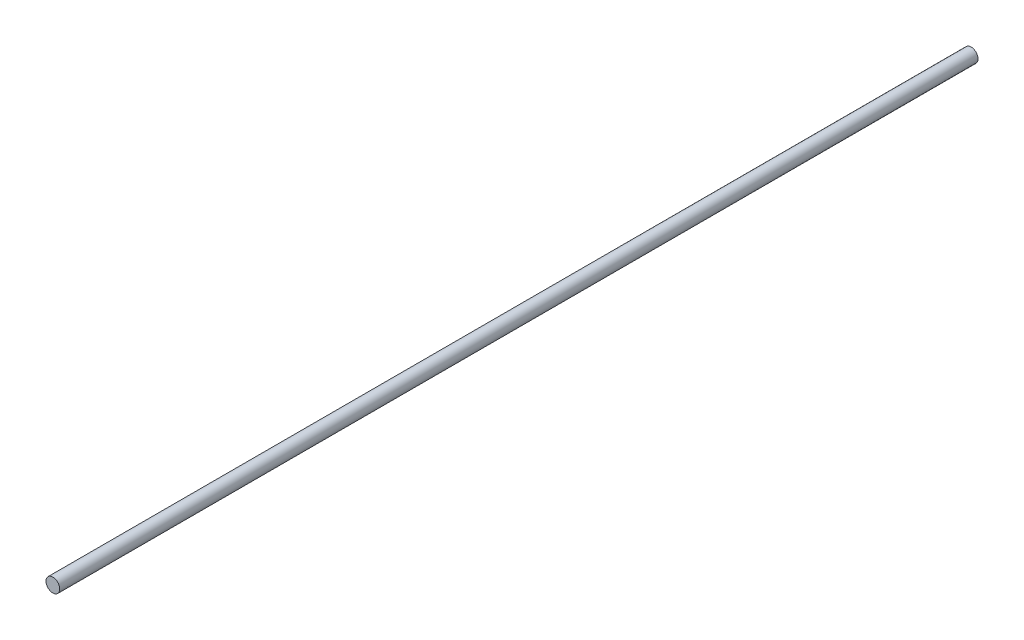
ISO-10303-21;
HEADER;
FILE_DESCRIPTION(('STEP AP214'),'2;1');
FILE_NAME('part.step','',(''),(''),'','','');
FILE_SCHEMA(('AUTOMOTIVE_DESIGN { 1 0 10303 214 1 1 1 1 }'));
ENDSEC;
DATA;
#1=APPLICATION_CONTEXT('core data for automotive mechanical design processes');
#2=APPLICATION_PROTOCOL_DEFINITION('international standard','automotive_design',2000,#1);
#3=PRODUCT_CONTEXT('',#1,'mechanical');
#4=PRODUCT('Part','Part','',(#3));
#5=PRODUCT_RELATED_PRODUCT_CATEGORY('part','',(#4));
#6=PRODUCT_DEFINITION_FORMATION('','',#4);
#7=PRODUCT_DEFINITION_CONTEXT('part definition',#1,'design');
#8=PRODUCT_DEFINITION('design','',#6,#7);
#9=PRODUCT_DEFINITION_SHAPE('','',#8);
#10=(LENGTH_UNIT() NAMED_UNIT(*) SI_UNIT(.MILLI.,.METRE.));
#11=(NAMED_UNIT(*) PLANE_ANGLE_UNIT() SI_UNIT($,.RADIAN.));
#12=(NAMED_UNIT(*) SI_UNIT($,.STERADIAN.) SOLID_ANGLE_UNIT());
#13=UNCERTAINTY_MEASURE_WITH_UNIT(LENGTH_MEASURE(1.E-05),#10,'distance_accuracy_value','');
#14=(GEOMETRIC_REPRESENTATION_CONTEXT(3) GLOBAL_UNCERTAINTY_ASSIGNED_CONTEXT((#13)) GLOBAL_UNIT_ASSIGNED_CONTEXT((#10,
#11,#12)) REPRESENTATION_CONTEXT('',''));
#15=CARTESIAN_POINT('',(0.,0.,0.));
#16=DIRECTION('',(0.,0.,1.));
#17=DIRECTION('',(1.,0.,0.));
#18=AXIS2_PLACEMENT_3D('',#15,#16,#17);
#19=CARTESIAN_POINT('',(0.,0.,400.));
#20=DIRECTION('',(0.,0.,-1.));
#21=DIRECTION('',(-1.,0.,0.));
#22=AXIS2_PLACEMENT_3D('',#19,#20,#21);
#23=CYLINDRICAL_SURFACE('',#22,3.);
#24=CARTESIAN_POINT('',(0.,0.,400.));
#25=DIRECTION('',(0.,0.,1.));
#26=DIRECTION('',(1.,0.,0.));
#27=AXIS2_PLACEMENT_3D('',#24,#25,#26);
#28=CIRCLE('',#27,3.);
#29=CARTESIAN_POINT('',(3.,0.,400.));
#30=VERTEX_POINT('',#29);
#31=EDGE_CURVE('E10',#30,#30,#28,.T.);
#32=ORIENTED_EDGE('',*,*,#31,.F.);
#33=EDGE_LOOP('',(#32));
#34=FACE_BOUND('',#33,.T.);
#35=CARTESIAN_POINT('',(0.,0.,0.));
#36=DIRECTION('',(0.,0.,1.));
#37=DIRECTION('',(1.,0.,0.));
#38=AXIS2_PLACEMENT_3D('',#35,#36,#37);
#39=CIRCLE('',#38,3.);
#40=CARTESIAN_POINT('',(3.,0.,0.));
#41=VERTEX_POINT('',#40);
#42=EDGE_CURVE('E38',#41,#41,#39,.T.);
#43=ORIENTED_EDGE('',*,*,#42,.T.);
#44=EDGE_LOOP('',(#43));
#45=FACE_BOUND('',#44,.T.);
#46=ADVANCED_FACE('F35',(#34,#45),#23,.T.);
#47=CARTESIAN_POINT('',(0.,0.,400.));
#48=DIRECTION('',(0.,0.,1.));
#49=DIRECTION('',(1.,0.,0.));
#50=AXIS2_PLACEMENT_3D('',#47,#48,#49);
#51=PLANE('',#50);
#52=ORIENTED_EDGE('',*,*,#31,.T.);
#53=EDGE_LOOP('',(#52));
#54=FACE_BOUND('',#53,.T.);
#55=ADVANCED_FACE('F50',(#54),#51,.T.);
#56=CARTESIAN_POINT('',(0.,0.,0.));
#57=DIRECTION('',(0.,0.,1.));
#58=DIRECTION('',(1.,0.,0.));
#59=AXIS2_PLACEMENT_3D('',#56,#57,#58);
#60=PLANE('',#59);
#61=ORIENTED_EDGE('',*,*,#42,.F.);
#62=EDGE_LOOP('',(#61));
#63=FACE_BOUND('',#62,.T.);
#64=ADVANCED_FACE('F48',(#63),#60,.F.);
#65=CLOSED_SHELL('',(#46,#55,#64));
#66=MANIFOLD_SOLID_BREP('B2',#65);
#67=ADVANCED_BREP_SHAPE_REPRESENTATION('',(#18,#66),#14);
#68=SHAPE_DEFINITION_REPRESENTATION(#9,#67);
ENDSEC;
END-ISO-10303-21;
